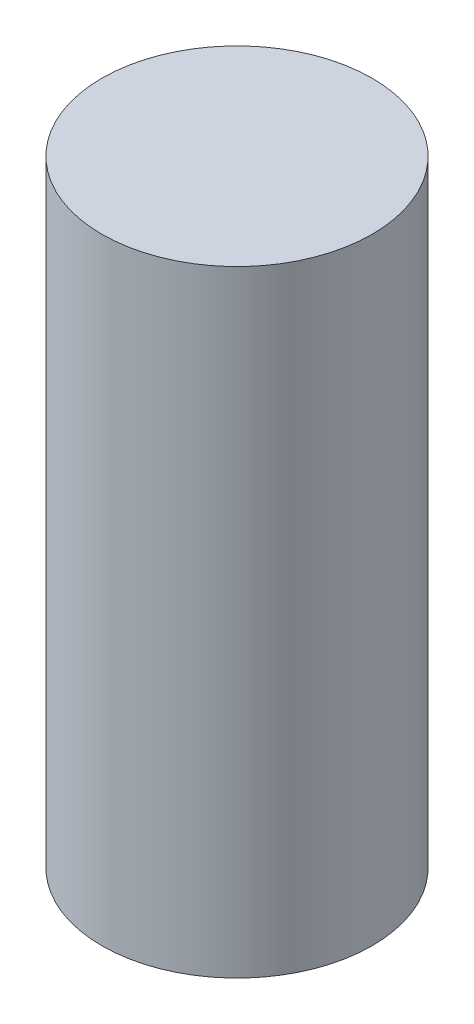
ISO-10303-21;
HEADER;
FILE_DESCRIPTION(('STEP AP214'),'2;1');
FILE_NAME('part.step','',(''),(''),'','','');
FILE_SCHEMA(('AUTOMOTIVE_DESIGN { 1 0 10303 214 1 1 1 1 }'));
ENDSEC;
DATA;
#1=APPLICATION_CONTEXT('core data for automotive mechanical design processes');
#2=APPLICATION_PROTOCOL_DEFINITION('international standard','automotive_design',2000,#1);
#3=PRODUCT_CONTEXT('',#1,'mechanical');
#4=PRODUCT('Part','Part','',(#3));
#5=PRODUCT_RELATED_PRODUCT_CATEGORY('part','',(#4));
#6=PRODUCT_DEFINITION_FORMATION('','',#4);
#7=PRODUCT_DEFINITION_CONTEXT('part definition',#1,'design');
#8=PRODUCT_DEFINITION('design','',#6,#7);
#9=PRODUCT_DEFINITION_SHAPE('','',#8);
#10=(LENGTH_UNIT() NAMED_UNIT(*) SI_UNIT(.MILLI.,.METRE.));
#11=(NAMED_UNIT(*) PLANE_ANGLE_UNIT() SI_UNIT($,.RADIAN.));
#12=(NAMED_UNIT(*) SI_UNIT($,.STERADIAN.) SOLID_ANGLE_UNIT());
#13=UNCERTAINTY_MEASURE_WITH_UNIT(LENGTH_MEASURE(1.E-05),#10,'distance_accuracy_value','');
#14=(GEOMETRIC_REPRESENTATION_CONTEXT(3) GLOBAL_UNCERTAINTY_ASSIGNED_CONTEXT((#13)) GLOBAL_UNIT_ASSIGNED_CONTEXT((#10,
#11,#12)) REPRESENTATION_CONTEXT('',''));
#15=CARTESIAN_POINT('',(0.,0.,0.));
#16=DIRECTION('',(0.,0.,1.));
#17=DIRECTION('',(1.,0.,0.));
#18=AXIS2_PLACEMENT_3D('',#15,#16,#17);
#19=CARTESIAN_POINT('',(0.,1500.,0.));
#20=DIRECTION('',(0.,-1.,0.));
#21=DIRECTION('',(0.,0.,-1.));
#22=AXIS2_PLACEMENT_3D('',#19,#20,#21);
#23=CYLINDRICAL_SURFACE('',#22,329.);
#24=CARTESIAN_POINT('',(0.,1500.,0.));
#25=DIRECTION('',(0.,1.,0.));
#26=DIRECTION('',(0.,0.,1.));
#27=AXIS2_PLACEMENT_3D('',#24,#25,#26);
#28=CIRCLE('',#27,329.);
#29=CARTESIAN_POINT('',(0.,1500.,329.));
#30=VERTEX_POINT('',#29);
#31=EDGE_CURVE('E10',#30,#30,#28,.T.);
#32=ORIENTED_EDGE('',*,*,#31,.F.);
#33=EDGE_LOOP('',(#32));
#34=FACE_BOUND('',#33,.T.);
#35=CARTESIAN_POINT('',(0.,0.,0.));
#36=DIRECTION('',(0.,1.,0.));
#37=DIRECTION('',(0.,0.,1.));
#38=AXIS2_PLACEMENT_3D('',#35,#36,#37);
#39=CIRCLE('',#38,329.);
#40=CARTESIAN_POINT('',(0.,0.,329.));
#41=VERTEX_POINT('',#40);
#42=EDGE_CURVE('E43',#41,#41,#39,.T.);
#43=ORIENTED_EDGE('',*,*,#42,.T.);
#44=EDGE_LOOP('',(#43));
#45=FACE_BOUND('',#44,.T.);
#46=ADVANCED_FACE('F40',(#34,#45),#23,.T.);
#47=CARTESIAN_POINT('',(0.,1500.,0.));
#48=DIRECTION('',(0.,1.,0.));
#49=DIRECTION('',(0.,0.,1.));
#50=AXIS2_PLACEMENT_3D('',#47,#48,#49);
#51=PLANE('',#50);
#52=ORIENTED_EDGE('',*,*,#31,.T.);
#53=EDGE_LOOP('',(#52));
#54=FACE_BOUND('',#53,.T.);
#55=ADVANCED_FACE('F57',(#54),#51,.T.);
#56=CARTESIAN_POINT('',(0.,0.,0.));
#57=DIRECTION('',(0.,1.,0.));
#58=DIRECTION('',(0.,0.,1.));
#59=AXIS2_PLACEMENT_3D('',#56,#57,#58);
#60=PLANE('',#59);
#61=ORIENTED_EDGE('',*,*,#42,.F.);
#62=EDGE_LOOP('',(#61));
#63=FACE_BOUND('',#62,.T.);
#64=ADVANCED_FACE('F55',(#63),#60,.F.);
#65=CLOSED_SHELL('',(#46,#55,#64));
#66=MANIFOLD_SOLID_BREP('B2',#65);
#67=ADVANCED_BREP_SHAPE_REPRESENTATION('',(#18,#66),#14);
#68=SHAPE_DEFINITION_REPRESENTATION(#9,#67);
ENDSEC;
END-ISO-10303-21;
